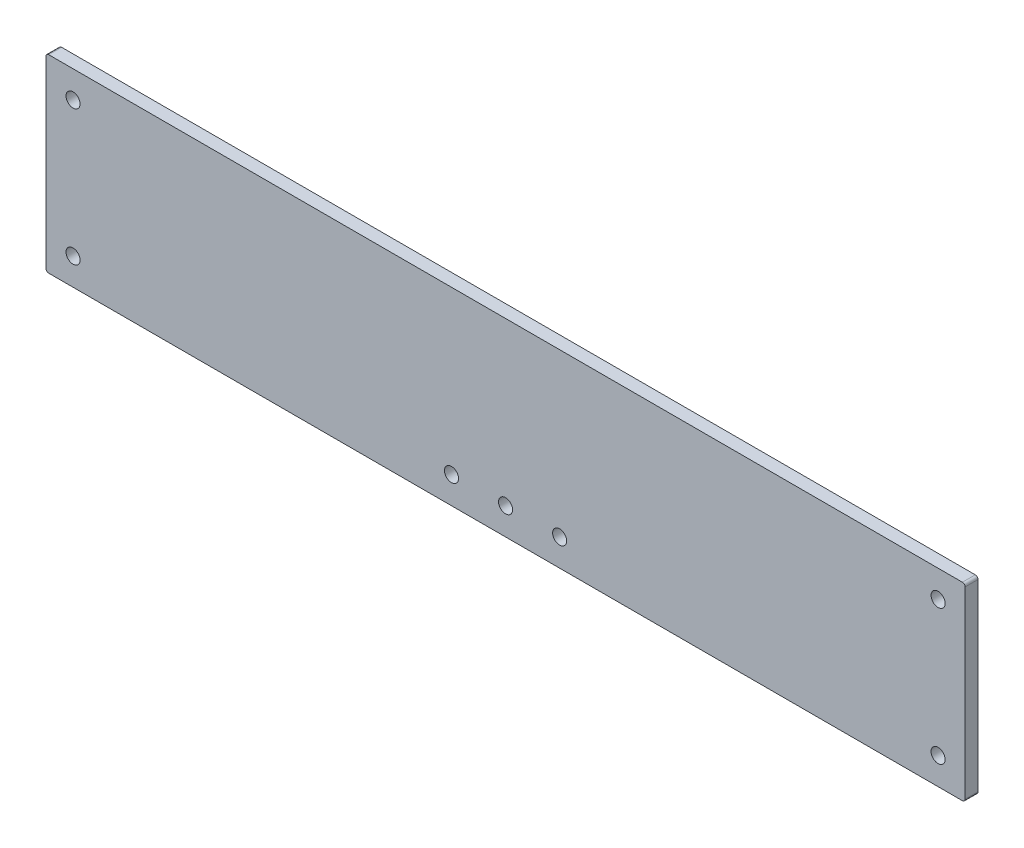
ISO-10303-21;
HEADER;
FILE_DESCRIPTION(('STEP AP214'),'2;1');
FILE_NAME('part.step','',(''),(''),'','','');
FILE_SCHEMA(('AUTOMOTIVE_DESIGN { 1 0 10303 214 1 1 1 1 }'));
ENDSEC;
DATA;
#1=APPLICATION_CONTEXT('core data for automotive mechanical design processes');
#2=APPLICATION_PROTOCOL_DEFINITION('international standard','automotive_design',2000,#1);
#3=PRODUCT_CONTEXT('',#1,'mechanical');
#4=PRODUCT('Part','Part','',(#3));
#5=PRODUCT_RELATED_PRODUCT_CATEGORY('part','',(#4));
#6=PRODUCT_DEFINITION_FORMATION('','',#4);
#7=PRODUCT_DEFINITION_CONTEXT('part definition',#1,'design');
#8=PRODUCT_DEFINITION('design','',#6,#7);
#9=PRODUCT_DEFINITION_SHAPE('','',#8);
#10=(LENGTH_UNIT() NAMED_UNIT(*) SI_UNIT(.MILLI.,.METRE.));
#11=(NAMED_UNIT(*) PLANE_ANGLE_UNIT() SI_UNIT($,.RADIAN.));
#12=(NAMED_UNIT(*) SI_UNIT($,.STERADIAN.) SOLID_ANGLE_UNIT());
#13=UNCERTAINTY_MEASURE_WITH_UNIT(LENGTH_MEASURE(1.E-05),#10,'distance_accuracy_value','');
#14=(GEOMETRIC_REPRESENTATION_CONTEXT(3) GLOBAL_UNCERTAINTY_ASSIGNED_CONTEXT((#13)) GLOBAL_UNIT_ASSIGNED_CONTEXT((#10,
#11,#12)) REPRESENTATION_CONTEXT('',''));
#15=CARTESIAN_POINT('',(0.,0.,0.));
#16=DIRECTION('',(0.,0.,1.));
#17=DIRECTION('',(1.,0.,0.));
#18=AXIS2_PLACEMENT_3D('',#15,#16,#17);
#19=CARTESIAN_POINT('',(0.999999999999985,69.,0.));
#20=DIRECTION('',(0.,0.,1.));
#21=DIRECTION('',(1.,0.,0.));
#22=AXIS2_PLACEMENT_3D('',#19,#20,#21);
#23=CYLINDRICAL_SURFACE('',#22,1.00000000000002);
#24=CARTESIAN_POINT('',(0.999999999999985,69.,4.7625));
#25=DIRECTION('',(0.,0.,1.));
#26=DIRECTION('',(1.,0.,0.));
#27=AXIS2_PLACEMENT_3D('',#24,#25,#26);
#28=CIRCLE('',#27,1.00000000000002);
#29=CARTESIAN_POINT('',(0.999999999999979,70.0000000000001,4.7625));
#30=VERTEX_POINT('',#29);
#31=CARTESIAN_POINT('',(0.,69.,4.7625));
#32=VERTEX_POINT('',#31);
#33=EDGE_CURVE('E131',#30,#32,#28,.T.);
#34=ORIENTED_EDGE('',*,*,#33,.F.);
#35=DIRECTION('',(0.,0.,1.));
#36=VECTOR('',#35,1.);
#37=CARTESIAN_POINT('',(0.999999999999979,70.0000000000001,0.));
#38=LINE('',#37,#36);
#39=CARTESIAN_POINT('',(0.999999999999979,70.0000000000001,0.));
#40=VERTEX_POINT('',#39);
#41=EDGE_CURVE('E11',#40,#30,#38,.T.);
#42=ORIENTED_EDGE('',*,*,#41,.F.);
#43=CARTESIAN_POINT('',(0.999999999999985,69.,0.));
#44=DIRECTION('',(0.,0.,1.));
#45=DIRECTION('',(1.,0.,0.));
#46=AXIS2_PLACEMENT_3D('',#43,#44,#45);
#47=CIRCLE('',#46,1.00000000000002);
#48=CARTESIAN_POINT('',(0.,69.,0.));
#49=VERTEX_POINT('',#48);
#50=EDGE_CURVE('E152',#40,#49,#47,.T.);
#51=ORIENTED_EDGE('',*,*,#50,.T.);
#52=DIRECTION('',(0.,0.,1.));
#53=VECTOR('',#52,1.);
#54=CARTESIAN_POINT('',(0.,69.,0.));
#55=LINE('',#54,#53);
#56=EDGE_CURVE('E37',#49,#32,#55,.T.);
#57=ORIENTED_EDGE('',*,*,#56,.T.);
#58=EDGE_LOOP('',(#34,#42,#51,#57));
#59=FACE_BOUND('',#58,.T.);
#60=ADVANCED_FACE('F34',(#59),#23,.T.);
#61=CARTESIAN_POINT('',(339.,70.0000000000001,0.));
#62=DIRECTION('',(0.,1.,0.));
#63=DIRECTION('',(-1.,0.,0.));
#64=AXIS2_PLACEMENT_3D('',#61,#62,#63);
#65=PLANE('',#64);
#66=DIRECTION('',(-1.,0.,0.));
#67=VECTOR('',#66,1.);
#68=CARTESIAN_POINT('',(339.,70.0000000000001,4.7625));
#69=LINE('',#68,#67);
#70=CARTESIAN_POINT('',(339.,70.0000000000001,4.7625));
#71=VERTEX_POINT('',#70);
#72=EDGE_CURVE('E150',#71,#30,#69,.T.);
#73=ORIENTED_EDGE('',*,*,#72,.F.);
#74=DIRECTION('',(0.,0.,1.));
#75=VECTOR('',#74,1.);
#76=CARTESIAN_POINT('',(339.,70.0000000000001,0.));
#77=LINE('',#76,#75);
#78=CARTESIAN_POINT('',(339.,70.0000000000001,0.));
#79=VERTEX_POINT('',#78);
#80=EDGE_CURVE('E43',#79,#71,#77,.T.);
#81=ORIENTED_EDGE('',*,*,#80,.F.);
#82=DIRECTION('',(-1.,0.,0.));
#83=VECTOR('',#82,1.);
#84=CARTESIAN_POINT('',(339.,70.0000000000001,0.));
#85=LINE('',#84,#83);
#86=EDGE_CURVE('E121',#79,#40,#85,.T.);
#87=ORIENTED_EDGE('',*,*,#86,.T.);
#88=ORIENTED_EDGE('',*,*,#41,.T.);
#89=EDGE_LOOP('',(#73,#81,#87,#88));
#90=FACE_BOUND('',#89,.T.);
#91=ADVANCED_FACE('F164',(#90),#65,.T.);
#92=CARTESIAN_POINT('',(339.,69.0000000000001,0.));
#93=DIRECTION('',(0.,0.,1.));
#94=DIRECTION('',(1.,0.,0.));
#95=AXIS2_PLACEMENT_3D('',#92,#93,#94);
#96=CYLINDRICAL_SURFACE('',#95,1.00000000000005);
#97=CARTESIAN_POINT('',(339.,69.0000000000001,4.7625));
#98=DIRECTION('',(0.,0.,1.));
#99=DIRECTION('',(1.,0.,0.));
#100=AXIS2_PLACEMENT_3D('',#97,#98,#99);
#101=CIRCLE('',#100,1.00000000000005);
#102=CARTESIAN_POINT('',(340.,69.0000000000001,4.7625));
#103=VERTEX_POINT('',#102);
#104=EDGE_CURVE('E108',#103,#71,#101,.T.);
#105=ORIENTED_EDGE('',*,*,#104,.F.);
#106=DIRECTION('',(0.,0.,1.));
#107=VECTOR('',#106,1.);
#108=CARTESIAN_POINT('',(340.,69.0000000000001,0.));
#109=LINE('',#108,#107);
#110=CARTESIAN_POINT('',(340.,69.0000000000001,0.));
#111=VERTEX_POINT('',#110);
#112=EDGE_CURVE('E103',#111,#103,#109,.T.);
#113=ORIENTED_EDGE('',*,*,#112,.F.);
#114=CARTESIAN_POINT('',(339.,69.0000000000001,0.));
#115=DIRECTION('',(0.,0.,1.));
#116=DIRECTION('',(1.,0.,0.));
#117=AXIS2_PLACEMENT_3D('',#114,#115,#116);
#118=CIRCLE('',#117,1.00000000000005);
#119=EDGE_CURVE('E106',#111,#79,#118,.T.);
#120=ORIENTED_EDGE('',*,*,#119,.T.);
#121=ORIENTED_EDGE('',*,*,#80,.T.);
#122=EDGE_LOOP('',(#105,#113,#120,#121));
#123=FACE_BOUND('',#122,.T.);
#124=ADVANCED_FACE('F105',(#123),#96,.T.);
#125=CARTESIAN_POINT('',(340.,0.999999999999997,0.));
#126=DIRECTION('',(1.,0.,0.));
#127=DIRECTION('',(0.,0.,-1.));
#128=AXIS2_PLACEMENT_3D('',#125,#126,#127);
#129=PLANE('',#128);
#130=DIRECTION('',(0.,1.,0.));
#131=VECTOR('',#130,1.);
#132=CARTESIAN_POINT('',(340.,0.999999999999997,4.7625));
#133=LINE('',#132,#131);
#134=CARTESIAN_POINT('',(340.,0.999999999999997,4.7625));
#135=VERTEX_POINT('',#134);
#136=EDGE_CURVE('E147',#135,#103,#133,.T.);
#137=ORIENTED_EDGE('',*,*,#136,.F.);
#138=DIRECTION('',(0.,0.,1.));
#139=VECTOR('',#138,1.);
#140=CARTESIAN_POINT('',(340.,0.999999999999997,0.));
#141=LINE('',#140,#139);
#142=CARTESIAN_POINT('',(340.,0.999999999999997,0.));
#143=VERTEX_POINT('',#142);
#144=EDGE_CURVE('E113',#143,#135,#141,.T.);
#145=ORIENTED_EDGE('',*,*,#144,.F.);
#146=DIRECTION('',(0.,1.,0.));
#147=VECTOR('',#146,1.);
#148=CARTESIAN_POINT('',(340.,0.999999999999997,0.));
#149=LINE('',#148,#147);
#150=EDGE_CURVE('E119',#143,#111,#149,.T.);
#151=ORIENTED_EDGE('',*,*,#150,.T.);
#152=ORIENTED_EDGE('',*,*,#112,.T.);
#153=EDGE_LOOP('',(#137,#145,#151,#152));
#154=FACE_BOUND('',#153,.T.);
#155=ADVANCED_FACE('F123',(#154),#129,.T.);
#156=CARTESIAN_POINT('',(339.,1.,0.));
#157=DIRECTION('',(0.,0.,1.));
#158=DIRECTION('',(1.,0.,0.));
#159=AXIS2_PLACEMENT_3D('',#156,#157,#158);
#160=CYLINDRICAL_SURFACE('',#159,1.00000000000003);
#161=CARTESIAN_POINT('',(339.,1.,4.7625));
#162=DIRECTION('',(0.,0.,1.));
#163=DIRECTION('',(1.,0.,0.));
#164=AXIS2_PLACEMENT_3D('',#161,#162,#163);
#165=CIRCLE('',#164,1.00000000000003);
#166=CARTESIAN_POINT('',(339.,0.,4.7625));
#167=VERTEX_POINT('',#166);
#168=EDGE_CURVE('E144',#167,#135,#165,.T.);
#169=ORIENTED_EDGE('',*,*,#168,.F.);
#170=DIRECTION('',(0.,0.,1.));
#171=VECTOR('',#170,1.);
#172=CARTESIAN_POINT('',(339.,0.,0.));
#173=LINE('',#172,#171);
#174=CARTESIAN_POINT('',(339.,0.,0.));
#175=VERTEX_POINT('',#174);
#176=EDGE_CURVE('E156',#175,#167,#173,.T.);
#177=ORIENTED_EDGE('',*,*,#176,.F.);
#178=CARTESIAN_POINT('',(339.,1.,0.));
#179=DIRECTION('',(0.,0.,1.));
#180=DIRECTION('',(1.,0.,0.));
#181=AXIS2_PLACEMENT_3D('',#178,#179,#180);
#182=CIRCLE('',#181,1.00000000000003);
#183=EDGE_CURVE('E124',#175,#143,#182,.T.);
#184=ORIENTED_EDGE('',*,*,#183,.T.);
#185=ORIENTED_EDGE('',*,*,#144,.T.);
#186=EDGE_LOOP('',(#169,#177,#184,#185));
#187=FACE_BOUND('',#186,.T.);
#188=ADVANCED_FACE('F177',(#187),#160,.T.);
#189=CARTESIAN_POINT('',(0.999999999999995,0.,0.));
#190=DIRECTION('',(0.,-1.,0.));
#191=DIRECTION('',(0.,0.,-1.));
#192=AXIS2_PLACEMENT_3D('',#189,#190,#191);
#193=PLANE('',#192);
#194=DIRECTION('',(1.,0.,0.));
#195=VECTOR('',#194,1.);
#196=CARTESIAN_POINT('',(0.999999999999995,0.,4.7625));
#197=LINE('',#196,#195);
#198=CARTESIAN_POINT('',(0.999999999999995,0.,4.7625));
#199=VERTEX_POINT('',#198);
#200=EDGE_CURVE('E141',#199,#167,#197,.T.);
#201=ORIENTED_EDGE('',*,*,#200,.F.);
#202=DIRECTION('',(0.,0.,1.));
#203=VECTOR('',#202,1.);
#204=CARTESIAN_POINT('',(0.999999999999995,0.,0.));
#205=LINE('',#204,#203);
#206=CARTESIAN_POINT('',(0.999999999999995,0.,0.));
#207=VERTEX_POINT('',#206);
#208=EDGE_CURVE('E158',#207,#199,#205,.T.);
#209=ORIENTED_EDGE('',*,*,#208,.F.);
#210=DIRECTION('',(1.,0.,0.));
#211=VECTOR('',#210,1.);
#212=CARTESIAN_POINT('',(0.999999999999995,0.,0.));
#213=LINE('',#212,#211);
#214=EDGE_CURVE('E126',#207,#175,#213,.T.);
#215=ORIENTED_EDGE('',*,*,#214,.T.);
#216=ORIENTED_EDGE('',*,*,#176,.T.);
#217=EDGE_LOOP('',(#201,#209,#215,#216));
#218=FACE_BOUND('',#217,.T.);
#219=ADVANCED_FACE('F180',(#218),#193,.T.);
#220=CARTESIAN_POINT('',(0.999999999999989,1.,0.));
#221=DIRECTION('',(0.,0.,1.));
#222=DIRECTION('',(1.,0.,0.));
#223=AXIS2_PLACEMENT_3D('',#220,#221,#222);
#224=CYLINDRICAL_SURFACE('',#223,0.999999999999995);
#225=CARTESIAN_POINT('',(0.999999999999989,1.,4.7625));
#226=DIRECTION('',(0.,0.,1.));
#227=DIRECTION('',(1.,0.,0.));
#228=AXIS2_PLACEMENT_3D('',#225,#226,#227);
#229=CIRCLE('',#228,0.999999999999995);
#230=CARTESIAN_POINT('',(0.,1.,4.7625));
#231=VERTEX_POINT('',#230);
#232=EDGE_CURVE('E138',#231,#199,#229,.T.);
#233=ORIENTED_EDGE('',*,*,#232,.F.);
#234=DIRECTION('',(0.,0.,1.));
#235=VECTOR('',#234,1.);
#236=CARTESIAN_POINT('',(0.,1.,0.));
#237=LINE('',#236,#235);
#238=CARTESIAN_POINT('',(0.,1.,0.));
#239=VERTEX_POINT('',#238);
#240=EDGE_CURVE('E159',#239,#231,#237,.T.);
#241=ORIENTED_EDGE('',*,*,#240,.F.);
#242=CARTESIAN_POINT('',(0.999999999999989,1.,0.));
#243=DIRECTION('',(0.,0.,1.));
#244=DIRECTION('',(1.,0.,0.));
#245=AXIS2_PLACEMENT_3D('',#242,#243,#244);
#246=CIRCLE('',#245,0.999999999999995);
#247=EDGE_CURVE('E276',#239,#207,#246,.T.);
#248=ORIENTED_EDGE('',*,*,#247,.T.);
#249=ORIENTED_EDGE('',*,*,#208,.T.);
#250=EDGE_LOOP('',(#233,#241,#248,#249));
#251=FACE_BOUND('',#250,.T.);
#252=ADVANCED_FACE('F184',(#251),#224,.T.);
#253=CARTESIAN_POINT('',(0.,69.,0.));
#254=DIRECTION('',(-1.,0.,0.));
#255=DIRECTION('',(0.,-1.,0.));
#256=AXIS2_PLACEMENT_3D('',#253,#254,#255);
#257=PLANE('',#256);
#258=DIRECTION('',(0.,-1.,0.));
#259=VECTOR('',#258,1.);
#260=CARTESIAN_POINT('',(0.,69.,4.7625));
#261=LINE('',#260,#259);
#262=EDGE_CURVE('E134',#32,#231,#261,.T.);
#263=ORIENTED_EDGE('',*,*,#262,.F.);
#264=ORIENTED_EDGE('',*,*,#56,.F.);
#265=DIRECTION('',(0.,-1.,0.));
#266=VECTOR('',#265,1.);
#267=CARTESIAN_POINT('',(0.,69.,0.));
#268=LINE('',#267,#266);
#269=EDGE_CURVE('E274',#49,#239,#268,.T.);
#270=ORIENTED_EDGE('',*,*,#269,.T.);
#271=ORIENTED_EDGE('',*,*,#240,.T.);
#272=EDGE_LOOP('',(#263,#264,#270,#271));
#273=FACE_BOUND('',#272,.T.);
#274=ADVANCED_FACE('F161',(#273),#257,.T.);
#275=CARTESIAN_POINT('',(0.999999999999985,69.,0.));
#276=DIRECTION('',(0.,0.,1.));
#277=DIRECTION('',(1.,0.,0.));
#278=AXIS2_PLACEMENT_3D('',#275,#276,#277);
#279=PLANE('',#278);
#280=CARTESIAN_POINT('',(190.,9.99999999999996,0.));
#281=DIRECTION('',(0.,0.,1.));
#282=DIRECTION('',(1.,0.,0.));
#283=AXIS2_PLACEMENT_3D('',#280,#281,#282);
#284=CIRCLE('',#283,2.59999999999999);
#285=CARTESIAN_POINT('',(192.6,9.99999999999996,0.));
#286=VERTEX_POINT('',#285);
#287=EDGE_CURVE('E231',#286,#286,#284,.T.);
#288=ORIENTED_EDGE('',*,*,#287,.T.);
#289=EDGE_LOOP('',(#288));
#290=FACE_BOUND('',#289,.T.);
#291=CARTESIAN_POINT('',(170.,9.99999999999996,0.));
#292=DIRECTION('',(0.,0.,1.));
#293=DIRECTION('',(1.,0.,0.));
#294=AXIS2_PLACEMENT_3D('',#291,#292,#293);
#295=CIRCLE('',#294,2.59999999999999);
#296=CARTESIAN_POINT('',(172.6,9.99999999999996,0.));
#297=VERTEX_POINT('',#296);
#298=EDGE_CURVE('E241',#297,#297,#295,.T.);
#299=ORIENTED_EDGE('',*,*,#298,.T.);
#300=EDGE_LOOP('',(#299));
#301=FACE_BOUND('',#300,.T.);
#302=CARTESIAN_POINT('',(330.,60.,0.));
#303=DIRECTION('',(0.,0.,1.));
#304=DIRECTION('',(1.,0.,0.));
#305=AXIS2_PLACEMENT_3D('',#302,#303,#304);
#306=CIRCLE('',#305,2.59999999999999);
#307=CARTESIAN_POINT('',(332.6,60.,0.));
#308=VERTEX_POINT('',#307);
#309=EDGE_CURVE('E247',#308,#308,#306,.T.);
#310=ORIENTED_EDGE('',*,*,#309,.T.);
#311=EDGE_LOOP('',(#310));
#312=FACE_BOUND('',#311,.T.);
#313=CARTESIAN_POINT('',(10.,10.,0.));
#314=DIRECTION('',(0.,0.,1.));
#315=DIRECTION('',(1.,0.,0.));
#316=AXIS2_PLACEMENT_3D('',#313,#314,#315);
#317=CIRCLE('',#316,2.59999999999998);
#318=CARTESIAN_POINT('',(12.6,10.,0.));
#319=VERTEX_POINT('',#318);
#320=EDGE_CURVE('E253',#319,#319,#317,.T.);
#321=ORIENTED_EDGE('',*,*,#320,.T.);
#322=EDGE_LOOP('',(#321));
#323=FACE_BOUND('',#322,.T.);
#324=CARTESIAN_POINT('',(10.,60.,0.));
#325=DIRECTION('',(0.,0.,1.));
#326=DIRECTION('',(1.,0.,0.));
#327=AXIS2_PLACEMENT_3D('',#324,#325,#326);
#328=CIRCLE('',#327,2.59999999999998);
#329=CARTESIAN_POINT('',(12.6,60.,0.));
#330=VERTEX_POINT('',#329);
#331=EDGE_CURVE('E259',#330,#330,#328,.T.);
#332=ORIENTED_EDGE('',*,*,#331,.T.);
#333=EDGE_LOOP('',(#332));
#334=FACE_BOUND('',#333,.T.);
#335=CARTESIAN_POINT('',(330.,10.,0.));
#336=DIRECTION('',(0.,0.,1.));
#337=DIRECTION('',(1.,0.,0.));
#338=AXIS2_PLACEMENT_3D('',#335,#336,#337);
#339=CIRCLE('',#338,2.59999999999999);
#340=CARTESIAN_POINT('',(332.6,10.,0.));
#341=VERTEX_POINT('',#340);
#342=EDGE_CURVE('E265',#341,#341,#339,.T.);
#343=ORIENTED_EDGE('',*,*,#342,.T.);
#344=EDGE_LOOP('',(#343));
#345=FACE_BOUND('',#344,.T.);
#346=CARTESIAN_POINT('',(150.,9.99999999999996,0.));
#347=DIRECTION('',(0.,0.,1.));
#348=DIRECTION('',(1.,0.,0.));
#349=AXIS2_PLACEMENT_3D('',#346,#347,#348);
#350=CIRCLE('',#349,2.59999999999999);
#351=CARTESIAN_POINT('',(152.6,9.99999999999996,0.));
#352=VERTEX_POINT('',#351);
#353=EDGE_CURVE('E135',#352,#352,#350,.T.);
#354=ORIENTED_EDGE('',*,*,#353,.T.);
#355=EDGE_LOOP('',(#354));
#356=FACE_BOUND('',#355,.T.);
#357=ORIENTED_EDGE('',*,*,#50,.F.);
#358=ORIENTED_EDGE('',*,*,#86,.F.);
#359=ORIENTED_EDGE('',*,*,#119,.F.);
#360=ORIENTED_EDGE('',*,*,#150,.F.);
#361=ORIENTED_EDGE('',*,*,#183,.F.);
#362=ORIENTED_EDGE('',*,*,#214,.F.);
#363=ORIENTED_EDGE('',*,*,#247,.F.);
#364=ORIENTED_EDGE('',*,*,#269,.F.);
#365=EDGE_LOOP('',(#357,#358,#359,#360,#361,#362,#363,#364));
#366=FACE_BOUND('',#365,.T.);
#367=ADVANCED_FACE('F117',(#290,#301,#312,#323,#334,#345,#356,#366),#279,.F.);
#368=CARTESIAN_POINT('',(0.999999999999985,69.,4.7625));
#369=DIRECTION('',(0.,0.,1.));
#370=DIRECTION('',(1.,0.,0.));
#371=AXIS2_PLACEMENT_3D('',#368,#369,#370);
#372=PLANE('',#371);
#373=CARTESIAN_POINT('',(190.,9.99999999999996,4.7625));
#374=DIRECTION('',(0.,0.,1.));
#375=DIRECTION('',(1.,0.,0.));
#376=AXIS2_PLACEMENT_3D('',#373,#374,#375);
#377=CIRCLE('',#376,2.59999999999999);
#378=CARTESIAN_POINT('',(192.6,9.99999999999996,4.7625));
#379=VERTEX_POINT('',#378);
#380=EDGE_CURVE('E234',#379,#379,#377,.T.);
#381=ORIENTED_EDGE('',*,*,#380,.F.);
#382=EDGE_LOOP('',(#381));
#383=FACE_BOUND('',#382,.T.);
#384=CARTESIAN_POINT('',(170.,9.99999999999996,4.7625));
#385=DIRECTION('',(0.,0.,1.));
#386=DIRECTION('',(1.,0.,0.));
#387=AXIS2_PLACEMENT_3D('',#384,#385,#386);
#388=CIRCLE('',#387,2.59999999999999);
#389=CARTESIAN_POINT('',(172.6,9.99999999999996,4.7625));
#390=VERTEX_POINT('',#389);
#391=EDGE_CURVE('E236',#390,#390,#388,.T.);
#392=ORIENTED_EDGE('',*,*,#391,.F.);
#393=EDGE_LOOP('',(#392));
#394=FACE_BOUND('',#393,.T.);
#395=CARTESIAN_POINT('',(330.,60.,4.7625));
#396=DIRECTION('',(0.,0.,1.));
#397=DIRECTION('',(1.,0.,0.));
#398=AXIS2_PLACEMENT_3D('',#395,#396,#397);
#399=CIRCLE('',#398,2.59999999999999);
#400=CARTESIAN_POINT('',(332.6,60.,4.7625));
#401=VERTEX_POINT('',#400);
#402=EDGE_CURVE('E244',#401,#401,#399,.T.);
#403=ORIENTED_EDGE('',*,*,#402,.F.);
#404=EDGE_LOOP('',(#403));
#405=FACE_BOUND('',#404,.T.);
#406=CARTESIAN_POINT('',(10.,10.,4.7625));
#407=DIRECTION('',(0.,0.,1.));
#408=DIRECTION('',(1.,0.,0.));
#409=AXIS2_PLACEMENT_3D('',#406,#407,#408);
#410=CIRCLE('',#409,2.59999999999998);
#411=CARTESIAN_POINT('',(12.6,10.,4.7625));
#412=VERTEX_POINT('',#411);
#413=EDGE_CURVE('E250',#412,#412,#410,.T.);
#414=ORIENTED_EDGE('',*,*,#413,.F.);
#415=EDGE_LOOP('',(#414));
#416=FACE_BOUND('',#415,.T.);
#417=CARTESIAN_POINT('',(10.,60.,4.7625));
#418=DIRECTION('',(0.,0.,1.));
#419=DIRECTION('',(1.,0.,0.));
#420=AXIS2_PLACEMENT_3D('',#417,#418,#419);
#421=CIRCLE('',#420,2.59999999999998);
#422=CARTESIAN_POINT('',(12.6,60.,4.7625));
#423=VERTEX_POINT('',#422);
#424=EDGE_CURVE('E256',#423,#423,#421,.T.);
#425=ORIENTED_EDGE('',*,*,#424,.F.);
#426=EDGE_LOOP('',(#425));
#427=FACE_BOUND('',#426,.T.);
#428=CARTESIAN_POINT('',(330.,10.,4.7625));
#429=DIRECTION('',(0.,0.,1.));
#430=DIRECTION('',(1.,0.,0.));
#431=AXIS2_PLACEMENT_3D('',#428,#429,#430);
#432=CIRCLE('',#431,2.59999999999999);
#433=CARTESIAN_POINT('',(332.6,10.,4.7625));
#434=VERTEX_POINT('',#433);
#435=EDGE_CURVE('E262',#434,#434,#432,.T.);
#436=ORIENTED_EDGE('',*,*,#435,.F.);
#437=EDGE_LOOP('',(#436));
#438=FACE_BOUND('',#437,.T.);
#439=CARTESIAN_POINT('',(150.,9.99999999999996,4.7625));
#440=DIRECTION('',(0.,0.,1.));
#441=DIRECTION('',(1.,0.,0.));
#442=AXIS2_PLACEMENT_3D('',#439,#440,#441);
#443=CIRCLE('',#442,2.59999999999999);
#444=CARTESIAN_POINT('',(152.6,9.99999999999996,4.7625));
#445=VERTEX_POINT('',#444);
#446=EDGE_CURVE('E268',#445,#445,#443,.T.);
#447=ORIENTED_EDGE('',*,*,#446,.F.);
#448=EDGE_LOOP('',(#447));
#449=FACE_BOUND('',#448,.T.);
#450=ORIENTED_EDGE('',*,*,#33,.T.);
#451=ORIENTED_EDGE('',*,*,#262,.T.);
#452=ORIENTED_EDGE('',*,*,#232,.T.);
#453=ORIENTED_EDGE('',*,*,#200,.T.);
#454=ORIENTED_EDGE('',*,*,#168,.T.);
#455=ORIENTED_EDGE('',*,*,#136,.T.);
#456=ORIENTED_EDGE('',*,*,#104,.T.);
#457=ORIENTED_EDGE('',*,*,#72,.T.);
#458=EDGE_LOOP('',(#450,#451,#452,#453,#454,#455,#456,#457));
#459=FACE_BOUND('',#458,.T.);
#460=ADVANCED_FACE('F163',(#383,#394,#405,#416,#427,#438,#449,#459),#372,.T.);
#461=CARTESIAN_POINT('',(150.,9.99999999999996,4.7625));
#462=DIRECTION('',(0.,0.,1.));
#463=DIRECTION('',(1.,0.,0.));
#464=AXIS2_PLACEMENT_3D('',#461,#462,#463);
#465=CYLINDRICAL_SURFACE('',#464,2.59999999999999);
#466=ORIENTED_EDGE('',*,*,#353,.F.);
#467=EDGE_LOOP('',(#466));
#468=FACE_BOUND('',#467,.T.);
#469=ORIENTED_EDGE('',*,*,#446,.T.);
#470=EDGE_LOOP('',(#469));
#471=FACE_BOUND('',#470,.T.);
#472=ADVANCED_FACE('F196',(#468,#471),#465,.F.);
#473=CARTESIAN_POINT('',(330.,10.,4.7625));
#474=DIRECTION('',(0.,0.,1.));
#475=DIRECTION('',(1.,0.,0.));
#476=AXIS2_PLACEMENT_3D('',#473,#474,#475);
#477=CYLINDRICAL_SURFACE('',#476,2.59999999999999);
#478=ORIENTED_EDGE('',*,*,#342,.F.);
#479=EDGE_LOOP('',(#478));
#480=FACE_BOUND('',#479,.T.);
#481=ORIENTED_EDGE('',*,*,#435,.T.);
#482=EDGE_LOOP('',(#481));
#483=FACE_BOUND('',#482,.T.);
#484=ADVANCED_FACE('F203',(#480,#483),#477,.F.);
#485=CARTESIAN_POINT('',(10.,60.,4.7625));
#486=DIRECTION('',(0.,0.,1.));
#487=DIRECTION('',(1.,0.,0.));
#488=AXIS2_PLACEMENT_3D('',#485,#486,#487);
#489=CYLINDRICAL_SURFACE('',#488,2.59999999999998);
#490=ORIENTED_EDGE('',*,*,#331,.F.);
#491=EDGE_LOOP('',(#490));
#492=FACE_BOUND('',#491,.T.);
#493=ORIENTED_EDGE('',*,*,#424,.T.);
#494=EDGE_LOOP('',(#493));
#495=FACE_BOUND('',#494,.T.);
#496=ADVANCED_FACE('F207',(#492,#495),#489,.F.);
#497=CARTESIAN_POINT('',(10.,10.,4.7625));
#498=DIRECTION('',(0.,0.,1.));
#499=DIRECTION('',(1.,0.,0.));
#500=AXIS2_PLACEMENT_3D('',#497,#498,#499);
#501=CYLINDRICAL_SURFACE('',#500,2.59999999999998);
#502=ORIENTED_EDGE('',*,*,#320,.F.);
#503=EDGE_LOOP('',(#502));
#504=FACE_BOUND('',#503,.T.);
#505=ORIENTED_EDGE('',*,*,#413,.T.);
#506=EDGE_LOOP('',(#505));
#507=FACE_BOUND('',#506,.T.);
#508=ADVANCED_FACE('F211',(#504,#507),#501,.F.);
#509=CARTESIAN_POINT('',(330.,60.,4.7625));
#510=DIRECTION('',(0.,0.,1.));
#511=DIRECTION('',(1.,0.,0.));
#512=AXIS2_PLACEMENT_3D('',#509,#510,#511);
#513=CYLINDRICAL_SURFACE('',#512,2.59999999999999);
#514=ORIENTED_EDGE('',*,*,#309,.F.);
#515=EDGE_LOOP('',(#514));
#516=FACE_BOUND('',#515,.T.);
#517=ORIENTED_EDGE('',*,*,#402,.T.);
#518=EDGE_LOOP('',(#517));
#519=FACE_BOUND('',#518,.T.);
#520=ADVANCED_FACE('F215',(#516,#519),#513,.F.);
#521=CARTESIAN_POINT('',(170.,9.99999999999996,4.7625));
#522=DIRECTION('',(0.,0.,1.));
#523=DIRECTION('',(1.,0.,0.));
#524=AXIS2_PLACEMENT_3D('',#521,#522,#523);
#525=CYLINDRICAL_SURFACE('',#524,2.59999999999999);
#526=ORIENTED_EDGE('',*,*,#298,.F.);
#527=EDGE_LOOP('',(#526));
#528=FACE_BOUND('',#527,.T.);
#529=ORIENTED_EDGE('',*,*,#391,.T.);
#530=EDGE_LOOP('',(#529));
#531=FACE_BOUND('',#530,.T.);
#532=ADVANCED_FACE('F219',(#528,#531),#525,.F.);
#533=CARTESIAN_POINT('',(190.,9.99999999999996,4.7625));
#534=DIRECTION('',(0.,0.,1.));
#535=DIRECTION('',(1.,0.,0.));
#536=AXIS2_PLACEMENT_3D('',#533,#534,#535);
#537=CYLINDRICAL_SURFACE('',#536,2.59999999999999);
#538=ORIENTED_EDGE('',*,*,#287,.F.);
#539=EDGE_LOOP('',(#538));
#540=FACE_BOUND('',#539,.T.);
#541=ORIENTED_EDGE('',*,*,#380,.T.);
#542=EDGE_LOOP('',(#541));
#543=FACE_BOUND('',#542,.T.);
#544=ADVANCED_FACE('F223',(#540,#543),#537,.F.);
#545=CLOSED_SHELL('',(#60,#91,#124,#155,#188,#219,#252,#274,#367,#460,#472,#484,#496,#508,#520,
#532,#544));
#546=MANIFOLD_SOLID_BREP('B2',#545);
#547=ADVANCED_BREP_SHAPE_REPRESENTATION('',(#18,#546),#14);
#548=SHAPE_DEFINITION_REPRESENTATION(#9,#547);
ENDSEC;
END-ISO-10303-21;
